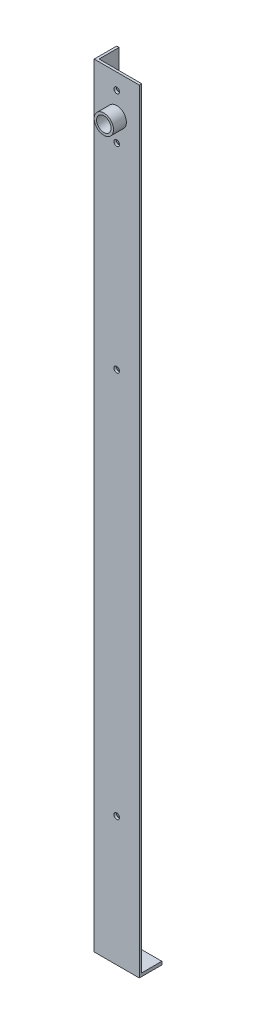
ISO-10303-21;
HEADER;
FILE_DESCRIPTION(('STEP AP214'),'2;1');
FILE_NAME('part.step','',(''),(''),'','','');
FILE_SCHEMA(('AUTOMOTIVE_DESIGN { 1 0 10303 214 1 1 1 1 }'));
ENDSEC;
DATA;
#1=APPLICATION_CONTEXT('core data for automotive mechanical design processes');
#2=APPLICATION_PROTOCOL_DEFINITION('international standard','automotive_design',2000,#1);
#3=PRODUCT_CONTEXT('',#1,'mechanical');
#4=PRODUCT('Part','Part','',(#3));
#5=PRODUCT_RELATED_PRODUCT_CATEGORY('part','',(#4));
#6=PRODUCT_DEFINITION_FORMATION('','',#4);
#7=PRODUCT_DEFINITION_CONTEXT('part definition',#1,'design');
#8=PRODUCT_DEFINITION('design','',#6,#7);
#9=PRODUCT_DEFINITION_SHAPE('','',#8);
#10=(LENGTH_UNIT() NAMED_UNIT(*) SI_UNIT(.MILLI.,.METRE.));
#11=(NAMED_UNIT(*) PLANE_ANGLE_UNIT() SI_UNIT($,.RADIAN.));
#12=(NAMED_UNIT(*) SI_UNIT($,.STERADIAN.) SOLID_ANGLE_UNIT());
#13=UNCERTAINTY_MEASURE_WITH_UNIT(LENGTH_MEASURE(1.E-05),#10,'distance_accuracy_value','');
#14=(GEOMETRIC_REPRESENTATION_CONTEXT(3) GLOBAL_UNCERTAINTY_ASSIGNED_CONTEXT((#13)) GLOBAL_UNIT_ASSIGNED_CONTEXT((#10,
#11,#12)) REPRESENTATION_CONTEXT('',''));
#15=CARTESIAN_POINT('',(0.,0.,0.));
#16=DIRECTION('',(0.,0.,1.));
#17=DIRECTION('',(1.,0.,0.));
#18=AXIS2_PLACEMENT_3D('',#15,#16,#17);
#19=CARTESIAN_POINT('',(-44.45,1524.,22.225));
#20=DIRECTION('',(0.,0.,-1.));
#21=DIRECTION('',(-1.,0.,0.));
#22=AXIS2_PLACEMENT_3D('',#19,#20,#21);
#23=PLANE('',#22);
#24=CARTESIAN_POINT('',(0.,1447.8,22.225));
#25=DIRECTION('',(0.,0.,1.));
#26=DIRECTION('',(1.,0.,0.));
#27=AXIS2_PLACEMENT_3D('',#24,#25,#26);
#28=CIRCLE('',#27,7.93749999999998);
#29=CARTESIAN_POINT('',(7.93749999999998,1447.8,22.225));
#30=VERTEX_POINT('',#29);
#31=EDGE_CURVE('E169',#30,#30,#28,.T.);
#32=ORIENTED_EDGE('',*,*,#31,.F.);
#33=EDGE_LOOP('',(#32));
#34=FACE_BOUND('',#33,.T.);
#35=CARTESIAN_POINT('',(0.,1447.8,22.225));
#36=DIRECTION('',(0.,0.,1.));
#37=DIRECTION('',(1.,0.,0.));
#38=AXIS2_PLACEMENT_3D('',#35,#36,#37);
#39=CIRCLE('',#38,14.2874999999999);
#40=CARTESIAN_POINT('',(14.2874999999999,1447.8,22.225));
#41=VERTEX_POINT('',#40);
#42=EDGE_CURVE('E147',#41,#41,#39,.T.);
#43=ORIENTED_EDGE('',*,*,#42,.T.);
#44=EDGE_LOOP('',(#43));
#45=FACE_BOUND('',#44,.T.);
#46=ADVANCED_FACE('F40',(#34,#45),#23,.F.);
#47=CARTESIAN_POINT('',(44.45,1524.,22.225));
#48=DIRECTION('',(-1.,0.,0.));
#49=DIRECTION('',(0.,0.,1.));
#50=AXIS2_PLACEMENT_3D('',#47,#48,#49);
#51=PLANE('',#50);
#52=DIRECTION('',(0.,-1.,0.));
#53=VECTOR('',#52,1.);
#54=CARTESIAN_POINT('',(44.45,1524.,22.225));
#55=LINE('',#54,#53);
#56=CARTESIAN_POINT('',(44.45,1524.,22.225));
#57=VERTEX_POINT('',#56);
#58=CARTESIAN_POINT('',(44.45,0.,22.225));
#59=VERTEX_POINT('',#58);
#60=EDGE_CURVE('E77',#57,#59,#55,.T.);
#61=ORIENTED_EDGE('',*,*,#60,.T.);
#62=DIRECTION('',(0.,0.,-1.));
#63=VECTOR('',#62,1.);
#64=CARTESIAN_POINT('',(44.45,0.,22.225));
#65=LINE('',#64,#63);
#66=CARTESIAN_POINT('',(44.45,0.,-22.225));
#67=VERTEX_POINT('',#66);
#68=EDGE_CURVE('E121',#59,#67,#65,.T.);
#69=ORIENTED_EDGE('',*,*,#68,.T.);
#70=DIRECTION('',(0.,-1.,0.));
#71=VECTOR('',#70,1.);
#72=CARTESIAN_POINT('',(44.45,6.35,-22.225));
#73=LINE('',#72,#71);
#74=CARTESIAN_POINT('',(44.45,6.35,-22.225));
#75=VERTEX_POINT('',#74);
#76=EDGE_CURVE('E112',#75,#67,#73,.T.);
#77=ORIENTED_EDGE('',*,*,#76,.F.);
#78=DIRECTION('',(0.,0.,1.));
#79=VECTOR('',#78,1.);
#80=CARTESIAN_POINT('',(44.45,6.35,-22.225));
#81=LINE('',#80,#79);
#82=CARTESIAN_POINT('',(44.45,6.35,17.4625));
#83=VERTEX_POINT('',#82);
#84=EDGE_CURVE('E116',#75,#83,#81,.T.);
#85=ORIENTED_EDGE('',*,*,#84,.T.);
#86=DIRECTION('',(0.,1.,0.));
#87=VECTOR('',#86,1.);
#88=CARTESIAN_POINT('',(44.45,-0.000999999999917733,17.4625));
#89=LINE('',#88,#87);
#90=CARTESIAN_POINT('',(44.45,1524.,17.4625));
#91=VERTEX_POINT('',#90);
#92=EDGE_CURVE('E153',#83,#91,#89,.T.);
#93=ORIENTED_EDGE('',*,*,#92,.T.);
#94=DIRECTION('',(0.,0.,-1.));
#95=VECTOR('',#94,1.);
#96=CARTESIAN_POINT('',(44.45,1524.,22.225));
#97=LINE('',#96,#95);
#98=EDGE_CURVE('E180',#57,#91,#97,.T.);
#99=ORIENTED_EDGE('',*,*,#98,.F.);
#100=EDGE_LOOP('',(#61,#69,#77,#85,#93,#99));
#101=FACE_BOUND('',#100,.T.);
#102=ADVANCED_FACE('F42',(#101),#51,.F.);
#103=CARTESIAN_POINT('',(-44.45,1524.,-22.225));
#104=DIRECTION('',(0.,0.,1.));
#105=DIRECTION('',(1.,0.,0.));
#106=AXIS2_PLACEMENT_3D('',#103,#104,#105);
#107=PLANE('',#106);
#108=DIRECTION('',(0.,1.,0.));
#109=VECTOR('',#108,1.);
#110=CARTESIAN_POINT('',(-39.6875,-0.000999999999917733,-22.225));
#111=LINE('',#110,#109);
#112=CARTESIAN_POINT('',(-39.6875,6.35,-22.225));
#113=VERTEX_POINT('',#112);
#114=CARTESIAN_POINT('',(-39.6875,1524.,-22.225));
#115=VERTEX_POINT('',#114);
#116=EDGE_CURVE('E113',#113,#115,#111,.T.);
#117=ORIENTED_EDGE('',*,*,#116,.F.);
#118=DIRECTION('',(1.,0.,0.));
#119=VECTOR('',#118,1.);
#120=CARTESIAN_POINT('',(-44.45,6.35,-22.225));
#121=LINE('',#120,#119);
#122=EDGE_CURVE('E108',#113,#75,#121,.T.);
#123=ORIENTED_EDGE('',*,*,#122,.T.);
#124=ORIENTED_EDGE('',*,*,#76,.T.);
#125=DIRECTION('',(-1.,0.,0.));
#126=VECTOR('',#125,1.);
#127=CARTESIAN_POINT('',(-44.45,0.,-22.225));
#128=LINE('',#127,#126);
#129=CARTESIAN_POINT('',(-44.45,0.,-22.225));
#130=VERTEX_POINT('',#129);
#131=EDGE_CURVE('E188',#67,#130,#128,.T.);
#132=ORIENTED_EDGE('',*,*,#131,.T.);
#133=DIRECTION('',(0.,-1.,0.));
#134=VECTOR('',#133,1.);
#135=CARTESIAN_POINT('',(-44.45,1524.,-22.225));
#136=LINE('',#135,#134);
#137=CARTESIAN_POINT('',(-44.45,1524.,-22.225));
#138=VERTEX_POINT('',#137);
#139=EDGE_CURVE('E195',#138,#130,#136,.T.);
#140=ORIENTED_EDGE('',*,*,#139,.F.);
#141=DIRECTION('',(-1.,0.,0.));
#142=VECTOR('',#141,1.);
#143=CARTESIAN_POINT('',(-44.45,1524.,-22.225));
#144=LINE('',#143,#142);
#145=EDGE_CURVE('E81',#115,#138,#144,.T.);
#146=ORIENTED_EDGE('',*,*,#145,.F.);
#147=EDGE_LOOP('',(#117,#123,#124,#132,#140,#146));
#148=FACE_BOUND('',#147,.T.);
#149=ADVANCED_FACE('F110',(#148),#107,.F.);
#150=CARTESIAN_POINT('',(-44.45,1524.,22.225));
#151=DIRECTION('',(1.,0.,0.));
#152=DIRECTION('',(0.,0.,-1.));
#153=AXIS2_PLACEMENT_3D('',#150,#151,#152);
#154=PLANE('',#153);
#155=ORIENTED_EDGE('',*,*,#139,.T.);
#156=DIRECTION('',(0.,0.,1.));
#157=VECTOR('',#156,1.);
#158=CARTESIAN_POINT('',(-44.45,0.,22.225));
#159=LINE('',#158,#157);
#160=CARTESIAN_POINT('',(-44.45,0.,22.225));
#161=VERTEX_POINT('',#160);
#162=EDGE_CURVE('E190',#130,#161,#159,.T.);
#163=ORIENTED_EDGE('',*,*,#162,.T.);
#164=DIRECTION('',(0.,-1.,0.));
#165=VECTOR('',#164,1.);
#166=CARTESIAN_POINT('',(-44.45,1524.,22.225));
#167=LINE('',#166,#165);
#168=CARTESIAN_POINT('',(-44.45,1524.,22.225));
#169=VERTEX_POINT('',#168);
#170=EDGE_CURVE('E71',#169,#161,#167,.T.);
#171=ORIENTED_EDGE('',*,*,#170,.F.);
#172=DIRECTION('',(0.,0.,1.));
#173=VECTOR('',#172,1.);
#174=CARTESIAN_POINT('',(-44.45,1524.,22.225));
#175=LINE('',#174,#173);
#176=EDGE_CURVE('E184',#138,#169,#175,.T.);
#177=ORIENTED_EDGE('',*,*,#176,.F.);
#178=EDGE_LOOP('',(#155,#163,#171,#177));
#179=FACE_BOUND('',#178,.T.);
#180=ADVANCED_FACE('F205',(#179),#154,.F.);
#181=CARTESIAN_POINT('',(0.,1447.8,22.225));
#182=DIRECTION('',(0.,0.,-1.));
#183=DIRECTION('',(-1.,0.,0.));
#184=AXIS2_PLACEMENT_3D('',#181,#182,#183);
#185=CIRCLE('',#184,19.05);
#186=CARTESIAN_POINT('',(-19.05,1447.8,22.225));
#187=VERTEX_POINT('',#186);
#188=EDGE_CURVE('E49',#187,#187,#185,.F.);
#189=ORIENTED_EDGE('',*,*,#188,.F.);
#190=EDGE_LOOP('',(#189));
#191=FACE_BOUND('',#190,.T.);
#192=CARTESIAN_POINT('',(0.,1402.7546875,22.225));
#193=DIRECTION('',(0.,0.,1.));
#194=DIRECTION('',(1.,0.,0.));
#195=AXIS2_PLACEMENT_3D('',#192,#193,#194);
#196=CIRCLE('',#195,5.58799999999997);
#197=CARTESIAN_POINT('',(5.58799999999997,1402.7546875,22.225));
#198=VERTEX_POINT('',#197);
#199=EDGE_CURVE('E165',#198,#198,#196,.T.);
#200=ORIENTED_EDGE('',*,*,#199,.F.);
#201=EDGE_LOOP('',(#200));
#202=FACE_BOUND('',#201,.T.);
#203=CARTESIAN_POINT('',(0.,1492.8453125,22.225));
#204=DIRECTION('',(0.,0.,1.));
#205=DIRECTION('',(1.,0.,0.));
#206=AXIS2_PLACEMENT_3D('',#203,#204,#205);
#207=CIRCLE('',#206,5.58799999999997);
#208=CARTESIAN_POINT('',(5.58799999999995,1492.8453125,22.225));
#209=VERTEX_POINT('',#208);
#210=EDGE_CURVE('E173',#209,#209,#207,.T.);
#211=ORIENTED_EDGE('',*,*,#210,.F.);
#212=EDGE_LOOP('',(#211));
#213=FACE_BOUND('',#212,.T.);
#214=CARTESIAN_POINT('',(0.,254.,22.225));
#215=DIRECTION('',(0.,0.,1.));
#216=DIRECTION('',(1.,0.,0.));
#217=AXIS2_PLACEMENT_3D('',#214,#215,#216);
#218=CIRCLE('',#217,5.58799999999997);
#219=CARTESIAN_POINT('',(5.58799999999997,254.,22.225));
#220=VERTEX_POINT('',#219);
#221=EDGE_CURVE('E170',#220,#220,#218,.T.);
#222=ORIENTED_EDGE('',*,*,#221,.F.);
#223=EDGE_LOOP('',(#222));
#224=FACE_BOUND('',#223,.T.);
#225=CARTESIAN_POINT('',(0.,1016.,22.225));
#226=DIRECTION('',(0.,0.,1.));
#227=DIRECTION('',(1.,0.,0.));
#228=AXIS2_PLACEMENT_3D('',#225,#226,#227);
#229=CIRCLE('',#228,5.58799999999995);
#230=CARTESIAN_POINT('',(5.58799999999995,1016.,22.225));
#231=VERTEX_POINT('',#230);
#232=EDGE_CURVE('E166',#231,#231,#229,.T.);
#233=ORIENTED_EDGE('',*,*,#232,.F.);
#234=EDGE_LOOP('',(#233));
#235=FACE_BOUND('',#234,.T.);
#236=ORIENTED_EDGE('',*,*,#170,.T.);
#237=DIRECTION('',(1.,0.,0.));
#238=VECTOR('',#237,1.);
#239=CARTESIAN_POINT('',(-44.45,0.,22.225));
#240=LINE('',#239,#238);
#241=EDGE_CURVE('E182',#161,#59,#240,.T.);
#242=ORIENTED_EDGE('',*,*,#241,.T.);
#243=ORIENTED_EDGE('',*,*,#60,.F.);
#244=DIRECTION('',(1.,0.,0.));
#245=VECTOR('',#244,1.);
#246=CARTESIAN_POINT('',(-44.45,1524.,22.225));
#247=LINE('',#246,#245);
#248=EDGE_CURVE('E57',#169,#57,#247,.T.);
#249=ORIENTED_EDGE('',*,*,#248,.F.);
#250=EDGE_LOOP('',(#236,#242,#243,#249));
#251=FACE_BOUND('',#250,.T.);
#252=ADVANCED_FACE('F201',(#191,#202,#213,#224,#235,#251),#23,.F.);
#253=CARTESIAN_POINT('',(0.,1524.,0.));
#254=DIRECTION('',(0.,-1.,0.));
#255=DIRECTION('',(0.,0.,-1.));
#256=AXIS2_PLACEMENT_3D('',#253,#254,#255);
#257=PLANE('',#256);
#258=ORIENTED_EDGE('',*,*,#98,.T.);
#259=DIRECTION('',(1.,0.,0.));
#260=VECTOR('',#259,1.);
#261=CARTESIAN_POINT('',(-39.6875,1524.,17.4625));
#262=LINE('',#261,#260);
#263=CARTESIAN_POINT('',(-39.6875,1524.,17.4625));
#264=VERTEX_POINT('',#263);
#265=EDGE_CURVE('E150',#264,#91,#262,.T.);
#266=ORIENTED_EDGE('',*,*,#265,.F.);
#267=DIRECTION('',(0.,0.,1.));
#268=VECTOR('',#267,1.);
#269=CARTESIAN_POINT('',(-39.6875,1524.,-17.4625));
#270=LINE('',#269,#268);
#271=EDGE_CURVE('E130',#115,#264,#270,.T.);
#272=ORIENTED_EDGE('',*,*,#271,.F.);
#273=ORIENTED_EDGE('',*,*,#145,.T.);
#274=ORIENTED_EDGE('',*,*,#176,.T.);
#275=ORIENTED_EDGE('',*,*,#248,.T.);
#276=EDGE_LOOP('',(#258,#266,#272,#273,#274,#275));
#277=FACE_BOUND('',#276,.T.);
#278=ADVANCED_FACE('F204',(#277),#257,.F.);
#279=CARTESIAN_POINT('',(0.,0.,0.));
#280=DIRECTION('',(0.,-1.,0.));
#281=DIRECTION('',(0.,0.,-1.));
#282=AXIS2_PLACEMENT_3D('',#279,#280,#281);
#283=PLANE('',#282);
#284=ORIENTED_EDGE('',*,*,#131,.F.);
#285=ORIENTED_EDGE('',*,*,#68,.F.);
#286=ORIENTED_EDGE('',*,*,#241,.F.);
#287=ORIENTED_EDGE('',*,*,#162,.F.);
#288=EDGE_LOOP('',(#284,#285,#286,#287));
#289=FACE_BOUND('',#288,.T.);
#290=ADVANCED_FACE('F228',(#289),#283,.T.);
#291=CARTESIAN_POINT('',(0.,1447.8,-22.226));
#292=DIRECTION('',(0.,0.,1.));
#293=DIRECTION('',(1.,0.,0.));
#294=AXIS2_PLACEMENT_3D('',#291,#292,#293);
#295=CYLINDRICAL_SURFACE('',#294,7.93749999999998);
#296=CARTESIAN_POINT('',(0.,1447.8,17.4625));
#297=DIRECTION('',(0.,0.,1.));
#298=DIRECTION('',(1.,0.,0.));
#299=AXIS2_PLACEMENT_3D('',#296,#297,#298);
#300=CIRCLE('',#299,7.93749999999998);
#301=CARTESIAN_POINT('',(7.93749999999998,1447.8,17.4625));
#302=VERTEX_POINT('',#301);
#303=EDGE_CURVE('E144',#302,#302,#300,.T.);
#304=ORIENTED_EDGE('',*,*,#303,.F.);
#305=EDGE_LOOP('',(#304));
#306=FACE_BOUND('',#305,.T.);
#307=ORIENTED_EDGE('',*,*,#31,.T.);
#308=EDGE_LOOP('',(#307));
#309=FACE_BOUND('',#308,.T.);
#310=ADVANCED_FACE('F218',(#306,#309),#295,.F.);
#311=CARTESIAN_POINT('',(0.,1016.,-22.226));
#312=DIRECTION('',(0.,0.,1.));
#313=DIRECTION('',(1.,0.,0.));
#314=AXIS2_PLACEMENT_3D('',#311,#312,#313);
#315=CYLINDRICAL_SURFACE('',#314,5.58799999999995);
#316=CARTESIAN_POINT('',(0.,1016.,17.4625));
#317=DIRECTION('',(0.,0.,1.));
#318=DIRECTION('',(1.,0.,0.));
#319=AXIS2_PLACEMENT_3D('',#316,#317,#318);
#320=CIRCLE('',#319,5.58799999999995);
#321=CARTESIAN_POINT('',(5.58799999999995,1016.,17.4625));
#322=VERTEX_POINT('',#321);
#323=EDGE_CURVE('E141',#322,#322,#320,.T.);
#324=ORIENTED_EDGE('',*,*,#323,.F.);
#325=EDGE_LOOP('',(#324));
#326=FACE_BOUND('',#325,.T.);
#327=ORIENTED_EDGE('',*,*,#232,.T.);
#328=EDGE_LOOP('',(#327));
#329=FACE_BOUND('',#328,.T.);
#330=ADVANCED_FACE('F215',(#326,#329),#315,.F.);
#331=CARTESIAN_POINT('',(0.,254.,-22.226));
#332=DIRECTION('',(0.,0.,1.));
#333=DIRECTION('',(1.,0.,0.));
#334=AXIS2_PLACEMENT_3D('',#331,#332,#333);
#335=CYLINDRICAL_SURFACE('',#334,5.58799999999997);
#336=CARTESIAN_POINT('',(0.,254.,17.4625));
#337=DIRECTION('',(0.,0.,1.));
#338=DIRECTION('',(1.,0.,0.));
#339=AXIS2_PLACEMENT_3D('',#336,#337,#338);
#340=CIRCLE('',#339,5.58799999999997);
#341=CARTESIAN_POINT('',(5.58799999999997,254.,17.4625));
#342=VERTEX_POINT('',#341);
#343=EDGE_CURVE('E138',#342,#342,#340,.T.);
#344=ORIENTED_EDGE('',*,*,#343,.F.);
#345=EDGE_LOOP('',(#344));
#346=FACE_BOUND('',#345,.T.);
#347=ORIENTED_EDGE('',*,*,#221,.T.);
#348=EDGE_LOOP('',(#347));
#349=FACE_BOUND('',#348,.T.);
#350=ADVANCED_FACE('F217',(#346,#349),#335,.F.);
#351=CARTESIAN_POINT('',(0.,1492.8453125,-22.226));
#352=DIRECTION('',(0.,0.,1.));
#353=DIRECTION('',(1.,0.,0.));
#354=AXIS2_PLACEMENT_3D('',#351,#352,#353);
#355=CYLINDRICAL_SURFACE('',#354,5.58799999999997);
#356=CARTESIAN_POINT('',(0.,1492.8453125,17.4625));
#357=DIRECTION('',(0.,0.,1.));
#358=DIRECTION('',(1.,0.,0.));
#359=AXIS2_PLACEMENT_3D('',#356,#357,#358);
#360=CIRCLE('',#359,5.58799999999997);
#361=CARTESIAN_POINT('',(5.58799999999995,1492.8453125,17.4625));
#362=VERTEX_POINT('',#361);
#363=EDGE_CURVE('E134',#362,#362,#360,.T.);
#364=ORIENTED_EDGE('',*,*,#363,.F.);
#365=EDGE_LOOP('',(#364));
#366=FACE_BOUND('',#365,.T.);
#367=ORIENTED_EDGE('',*,*,#210,.T.);
#368=EDGE_LOOP('',(#367));
#369=FACE_BOUND('',#368,.T.);
#370=ADVANCED_FACE('F225',(#366,#369),#355,.F.);
#371=CARTESIAN_POINT('',(0.,1402.7546875,-22.226));
#372=DIRECTION('',(0.,0.,1.));
#373=DIRECTION('',(1.,0.,0.));
#374=AXIS2_PLACEMENT_3D('',#371,#372,#373);
#375=CYLINDRICAL_SURFACE('',#374,5.58799999999997);
#376=CARTESIAN_POINT('',(0.,1402.7546875,17.4625));
#377=DIRECTION('',(0.,0.,1.));
#378=DIRECTION('',(1.,0.,0.));
#379=AXIS2_PLACEMENT_3D('',#376,#377,#378);
#380=CIRCLE('',#379,5.58799999999997);
#381=CARTESIAN_POINT('',(5.58799999999997,1402.7546875,17.4625));
#382=VERTEX_POINT('',#381);
#383=EDGE_CURVE('E131',#382,#382,#380,.T.);
#384=ORIENTED_EDGE('',*,*,#383,.F.);
#385=EDGE_LOOP('',(#384));
#386=FACE_BOUND('',#385,.T.);
#387=ORIENTED_EDGE('',*,*,#199,.T.);
#388=EDGE_LOOP('',(#387));
#389=FACE_BOUND('',#388,.T.);
#390=ADVANCED_FACE('F294',(#386,#389),#375,.F.);
#391=CARTESIAN_POINT('',(0.,1447.8,47.625));
#392=DIRECTION('',(0.,0.,1.));
#393=DIRECTION('',(1.,0.,0.));
#394=AXIS2_PLACEMENT_3D('',#391,#392,#393);
#395=PLANE('',#394);
#396=CARTESIAN_POINT('',(0.,1447.8,47.625));
#397=DIRECTION('',(0.,0.,1.));
#398=DIRECTION('',(1.,0.,0.));
#399=AXIS2_PLACEMENT_3D('',#396,#397,#398);
#400=CIRCLE('',#399,19.05);
#401=CARTESIAN_POINT('',(19.05,1447.8,47.625));
#402=VERTEX_POINT('',#401);
#403=EDGE_CURVE('E160',#402,#402,#400,.T.);
#404=ORIENTED_EDGE('',*,*,#403,.T.);
#405=EDGE_LOOP('',(#404));
#406=FACE_BOUND('',#405,.T.);
#407=CARTESIAN_POINT('',(0.,1447.8,47.625));
#408=DIRECTION('',(0.,0.,1.));
#409=DIRECTION('',(1.,0.,0.));
#410=AXIS2_PLACEMENT_3D('',#407,#408,#409);
#411=CIRCLE('',#410,14.2874999999999);
#412=CARTESIAN_POINT('',(14.2874999999999,1447.8,47.625));
#413=VERTEX_POINT('',#412);
#414=EDGE_CURVE('E157',#413,#413,#411,.T.);
#415=ORIENTED_EDGE('',*,*,#414,.F.);
#416=EDGE_LOOP('',(#415));
#417=FACE_BOUND('',#416,.T.);
#418=ADVANCED_FACE('F303',(#406,#417),#395,.T.);
#419=CARTESIAN_POINT('',(0.,1447.8,47.625));
#420=DIRECTION('',(0.,0.,-1.));
#421=DIRECTION('',(-1.,0.,0.));
#422=AXIS2_PLACEMENT_3D('',#419,#420,#421);
#423=CYLINDRICAL_SURFACE('',#422,19.05);
#424=ORIENTED_EDGE('',*,*,#403,.F.);
#425=EDGE_LOOP('',(#424));
#426=FACE_BOUND('',#425,.T.);
#427=ORIENTED_EDGE('',*,*,#188,.T.);
#428=EDGE_LOOP('',(#427));
#429=FACE_BOUND('',#428,.T.);
#430=ADVANCED_FACE('F199',(#426,#429),#423,.T.);
#431=CARTESIAN_POINT('',(0.,1447.8,47.625));
#432=DIRECTION('',(0.,0.,-1.));
#433=DIRECTION('',(-1.,0.,0.));
#434=AXIS2_PLACEMENT_3D('',#431,#432,#433);
#435=CYLINDRICAL_SURFACE('',#434,14.2874999999999);
#436=ORIENTED_EDGE('',*,*,#414,.T.);
#437=EDGE_LOOP('',(#436));
#438=FACE_BOUND('',#437,.T.);
#439=ORIENTED_EDGE('',*,*,#42,.F.);
#440=EDGE_LOOP('',(#439));
#441=FACE_BOUND('',#440,.T.);
#442=ADVANCED_FACE('F350',(#438,#441),#435,.F.);
#443=CARTESIAN_POINT('',(-39.6875,-0.000999999999917733,17.4625));
#444=DIRECTION('',(0.,0.,1.));
#445=DIRECTION('',(1.,0.,0.));
#446=AXIS2_PLACEMENT_3D('',#443,#444,#445);
#447=PLANE('',#446);
#448=ORIENTED_EDGE('',*,*,#303,.T.);
#449=EDGE_LOOP('',(#448));
#450=FACE_BOUND('',#449,.T.);
#451=ORIENTED_EDGE('',*,*,#323,.T.);
#452=EDGE_LOOP('',(#451));
#453=FACE_BOUND('',#452,.T.);
#454=ORIENTED_EDGE('',*,*,#343,.T.);
#455=EDGE_LOOP('',(#454));
#456=FACE_BOUND('',#455,.T.);
#457=ORIENTED_EDGE('',*,*,#363,.T.);
#458=EDGE_LOOP('',(#457));
#459=FACE_BOUND('',#458,.T.);
#460=ORIENTED_EDGE('',*,*,#383,.T.);
#461=EDGE_LOOP('',(#460));
#462=FACE_BOUND('',#461,.T.);
#463=ORIENTED_EDGE('',*,*,#92,.F.);
#464=DIRECTION('',(-1.,0.,0.));
#465=VECTOR('',#464,1.);
#466=CARTESIAN_POINT('',(-39.6875,6.35,17.4625));
#467=LINE('',#466,#465);
#468=CARTESIAN_POINT('',(-39.6875,6.35,17.4625));
#469=VERTEX_POINT('',#468);
#470=EDGE_CURVE('E123',#83,#469,#467,.T.);
#471=ORIENTED_EDGE('',*,*,#470,.T.);
#472=DIRECTION('',(0.,1.,0.));
#473=VECTOR('',#472,1.);
#474=CARTESIAN_POINT('',(-39.6875,-0.000999999999917733,17.4625));
#475=LINE('',#474,#473);
#476=EDGE_CURVE('E135',#469,#264,#475,.T.);
#477=ORIENTED_EDGE('',*,*,#476,.T.);
#478=ORIENTED_EDGE('',*,*,#265,.T.);
#479=EDGE_LOOP('',(#463,#471,#477,#478));
#480=FACE_BOUND('',#479,.T.);
#481=ADVANCED_FACE('F343',(#450,#453,#456,#459,#462,#480),#447,.F.);
#482=CARTESIAN_POINT('',(-39.6875,-0.000999999999917733,-17.4625));
#483=DIRECTION('',(-1.,0.,0.));
#484=DIRECTION('',(0.,0.,1.));
#485=AXIS2_PLACEMENT_3D('',#482,#483,#484);
#486=PLANE('',#485);
#487=ORIENTED_EDGE('',*,*,#476,.F.);
#488=DIRECTION('',(0.,0.,-1.));
#489=VECTOR('',#488,1.);
#490=CARTESIAN_POINT('',(-39.6875,6.35,-17.4625));
#491=LINE('',#490,#489);
#492=EDGE_CURVE('E11',#469,#113,#491,.T.);
#493=ORIENTED_EDGE('',*,*,#492,.T.);
#494=ORIENTED_EDGE('',*,*,#116,.T.);
#495=ORIENTED_EDGE('',*,*,#271,.T.);
#496=EDGE_LOOP('',(#487,#493,#494,#495));
#497=FACE_BOUND('',#496,.T.);
#498=ADVANCED_FACE('F320',(#497),#486,.F.);
#499=CARTESIAN_POINT('',(0.,6.35,0.));
#500=DIRECTION('',(0.,1.,0.));
#501=DIRECTION('',(0.,0.,1.));
#502=AXIS2_PLACEMENT_3D('',#499,#500,#501);
#503=PLANE('',#502);
#504=ORIENTED_EDGE('',*,*,#470,.F.);
#505=ORIENTED_EDGE('',*,*,#84,.F.);
#506=ORIENTED_EDGE('',*,*,#122,.F.);
#507=ORIENTED_EDGE('',*,*,#492,.F.);
#508=EDGE_LOOP('',(#504,#505,#506,#507));
#509=FACE_BOUND('',#508,.T.);
#510=ADVANCED_FACE('F125',(#509),#503,.T.);
#511=CLOSED_SHELL('',(#46,#102,#149,#180,#252,#278,#290,#310,#330,#350,#370,#390,#418,#430,#442,
#481,#498,#510));
#512=MANIFOLD_SOLID_BREP('B2',#511);
#513=ADVANCED_BREP_SHAPE_REPRESENTATION('',(#18,#512),#14);
#514=SHAPE_DEFINITION_REPRESENTATION(#9,#513);
ENDSEC;
END-ISO-10303-21;
